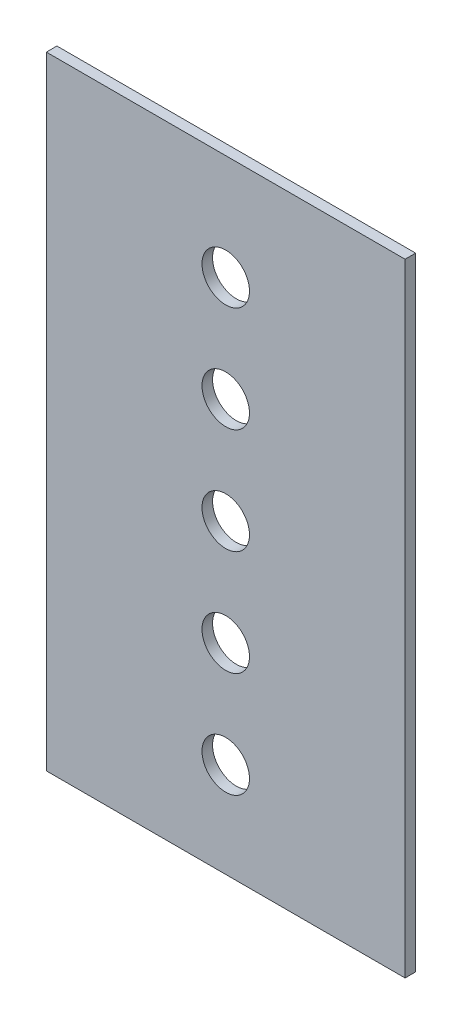
ISO-10303-21;
HEADER;
FILE_DESCRIPTION(('STEP AP214'),'2;1');
FILE_NAME('part.step','',(''),(''),'','','');
FILE_SCHEMA(('AUTOMOTIVE_DESIGN { 1 0 10303 214 1 1 1 1 }'));
ENDSEC;
DATA;
#1=APPLICATION_CONTEXT('core data for automotive mechanical design processes');
#2=APPLICATION_PROTOCOL_DEFINITION('international standard','automotive_design',2000,#1);
#3=PRODUCT_CONTEXT('',#1,'mechanical');
#4=PRODUCT('Part','Part','',(#3));
#5=PRODUCT_RELATED_PRODUCT_CATEGORY('part','',(#4));
#6=PRODUCT_DEFINITION_FORMATION('','',#4);
#7=PRODUCT_DEFINITION_CONTEXT('part definition',#1,'design');
#8=PRODUCT_DEFINITION('design','',#6,#7);
#9=PRODUCT_DEFINITION_SHAPE('','',#8);
#10=(LENGTH_UNIT() NAMED_UNIT(*) SI_UNIT(.MILLI.,.METRE.));
#11=(NAMED_UNIT(*) PLANE_ANGLE_UNIT() SI_UNIT($,.RADIAN.));
#12=(NAMED_UNIT(*) SI_UNIT($,.STERADIAN.) SOLID_ANGLE_UNIT());
#13=UNCERTAINTY_MEASURE_WITH_UNIT(LENGTH_MEASURE(1.E-05),#10,'distance_accuracy_value','');
#14=(GEOMETRIC_REPRESENTATION_CONTEXT(3) GLOBAL_UNCERTAINTY_ASSIGNED_CONTEXT((#13)) GLOBAL_UNIT_ASSIGNED_CONTEXT((#10,
#11,#12)) REPRESENTATION_CONTEXT('',''));
#15=CARTESIAN_POINT('',(0.,0.,0.));
#16=DIRECTION('',(0.,0.,1.));
#17=DIRECTION('',(1.,0.,0.));
#18=AXIS2_PLACEMENT_3D('',#15,#16,#17);
#19=CARTESIAN_POINT('',(0.,0.,1.));
#20=DIRECTION('',(0.,0.,1.));
#21=DIRECTION('',(1.,0.,0.));
#22=AXIS2_PLACEMENT_3D('',#19,#20,#21);
#23=PLANE('',#22);
#24=CARTESIAN_POINT('',(-27.,9.74935860311225,1.));
#25=DIRECTION('',(0.,0.,1.));
#26=DIRECTION('',(1.,0.,0.));
#27=AXIS2_PLACEMENT_3D('',#24,#25,#26);
#28=CIRCLE('',#27,2.25);
#29=CARTESIAN_POINT('',(-24.75,9.74935860311225,1.));
#30=VERTEX_POINT('',#29);
#31=EDGE_CURVE('E130',#30,#30,#28,.T.);
#32=ORIENTED_EDGE('',*,*,#31,.F.);
#33=EDGE_LOOP('',(#32));
#34=FACE_BOUND('',#33,.T.);
#35=CARTESIAN_POINT('',(-27.,29.75,1.));
#36=DIRECTION('',(0.,0.,1.));
#37=DIRECTION('',(1.,0.,0.));
#38=AXIS2_PLACEMENT_3D('',#35,#36,#37);
#39=CIRCLE('',#38,2.25);
#40=CARTESIAN_POINT('',(-24.75,29.75,1.));
#41=VERTEX_POINT('',#40);
#42=EDGE_CURVE('E118',#41,#41,#39,.T.);
#43=ORIENTED_EDGE('',*,*,#42,.F.);
#44=EDGE_LOOP('',(#43));
#45=FACE_BOUND('',#44,.T.);
#46=DIRECTION('',(1.,0.,0.));
#47=VECTOR('',#46,1.);
#48=CARTESIAN_POINT('',(-44.,-9.25,1.));
#49=LINE('',#48,#47);
#50=CARTESIAN_POINT('',(-44.,-9.25,1.));
#51=VERTEX_POINT('',#50);
#52=CARTESIAN_POINT('',(-9.99999999999999,-9.25,1.));
#53=VERTEX_POINT('',#52);
#54=EDGE_CURVE('E88',#51,#53,#49,.T.);
#55=ORIENTED_EDGE('',*,*,#54,.T.);
#56=DIRECTION('',(0.,1.,0.));
#57=VECTOR('',#56,1.);
#58=CARTESIAN_POINT('',(-9.99999999999999,-9.25,1.));
#59=LINE('',#58,#57);
#60=CARTESIAN_POINT('',(-9.99999999999998,49.75,1.));
#61=VERTEX_POINT('',#60);
#62=EDGE_CURVE('E83',#53,#61,#59,.T.);
#63=ORIENTED_EDGE('',*,*,#62,.T.);
#64=DIRECTION('',(-1.,0.,0.));
#65=VECTOR('',#64,1.);
#66=CARTESIAN_POINT('',(-9.99999999999998,49.75,1.));
#67=LINE('',#66,#65);
#68=CARTESIAN_POINT('',(-44.,49.75,1.));
#69=VERTEX_POINT('',#68);
#70=EDGE_CURVE('E86',#61,#69,#67,.T.);
#71=ORIENTED_EDGE('',*,*,#70,.T.);
#72=DIRECTION('',(0.,-1.,0.));
#73=VECTOR('',#72,1.);
#74=CARTESIAN_POINT('',(-44.,49.75,1.));
#75=LINE('',#74,#73);
#76=EDGE_CURVE('E53',#69,#51,#75,.T.);
#77=ORIENTED_EDGE('',*,*,#76,.T.);
#78=EDGE_LOOP('',(#55,#63,#71,#77));
#79=FACE_BOUND('',#78,.T.);
#80=CARTESIAN_POINT('',(-27.,39.75,1.));
#81=DIRECTION('',(0.,0.,1.));
#82=DIRECTION('',(1.,0.,0.));
#83=AXIS2_PLACEMENT_3D('',#80,#81,#82);
#84=CIRCLE('',#83,2.25);
#85=CARTESIAN_POINT('',(-24.75,39.75,1.));
#86=VERTEX_POINT('',#85);
#87=EDGE_CURVE('E103',#86,#86,#84,.T.);
#88=ORIENTED_EDGE('',*,*,#87,.F.);
#89=EDGE_LOOP('',(#88));
#90=FACE_BOUND('',#89,.T.);
#91=CARTESIAN_POINT('',(-27.,19.75,1.));
#92=DIRECTION('',(0.,0.,1.));
#93=DIRECTION('',(1.,0.,0.));
#94=AXIS2_PLACEMENT_3D('',#91,#92,#93);
#95=CIRCLE('',#94,2.25);
#96=CARTESIAN_POINT('',(-24.75,19.75,1.));
#97=VERTEX_POINT('',#96);
#98=EDGE_CURVE('E124',#97,#97,#95,.T.);
#99=ORIENTED_EDGE('',*,*,#98,.F.);
#100=EDGE_LOOP('',(#99));
#101=FACE_BOUND('',#100,.T.);
#102=CARTESIAN_POINT('',(-27.,-0.250641396887753,1.));
#103=DIRECTION('',(0.,0.,1.));
#104=DIRECTION('',(1.,0.,0.));
#105=AXIS2_PLACEMENT_3D('',#102,#103,#104);
#106=CIRCLE('',#105,2.25);
#107=CARTESIAN_POINT('',(-24.75,-0.250641396887753,1.));
#108=VERTEX_POINT('',#107);
#109=EDGE_CURVE('E136',#108,#108,#106,.T.);
#110=ORIENTED_EDGE('',*,*,#109,.F.);
#111=EDGE_LOOP('',(#110));
#112=FACE_BOUND('',#111,.T.);
#113=ADVANCED_FACE('F36',(#34,#45,#79,#90,#101,#112),#23,.T.);
#114=CARTESIAN_POINT('',(0.,0.,0.));
#115=DIRECTION('',(0.,0.,1.));
#116=DIRECTION('',(1.,0.,0.));
#117=AXIS2_PLACEMENT_3D('',#114,#115,#116);
#118=PLANE('',#117);
#119=CARTESIAN_POINT('',(-27.,9.74935860311225,0.));
#120=DIRECTION('',(0.,0.,1.));
#121=DIRECTION('',(1.,0.,0.));
#122=AXIS2_PLACEMENT_3D('',#119,#120,#121);
#123=CIRCLE('',#122,2.25);
#124=CARTESIAN_POINT('',(-24.75,9.74935860311225,0.));
#125=VERTEX_POINT('',#124);
#126=EDGE_CURVE('E133',#125,#125,#123,.T.);
#127=ORIENTED_EDGE('',*,*,#126,.T.);
#128=EDGE_LOOP('',(#127));
#129=FACE_BOUND('',#128,.T.);
#130=CARTESIAN_POINT('',(-27.,29.75,0.));
#131=DIRECTION('',(0.,0.,1.));
#132=DIRECTION('',(1.,0.,0.));
#133=AXIS2_PLACEMENT_3D('',#130,#131,#132);
#134=CIRCLE('',#133,2.25);
#135=CARTESIAN_POINT('',(-24.75,29.75,0.));
#136=VERTEX_POINT('',#135);
#137=EDGE_CURVE('E121',#136,#136,#134,.T.);
#138=ORIENTED_EDGE('',*,*,#137,.T.);
#139=EDGE_LOOP('',(#138));
#140=FACE_BOUND('',#139,.T.);
#141=DIRECTION('',(1.,0.,0.));
#142=VECTOR('',#141,1.);
#143=CARTESIAN_POINT('',(-44.,-9.25,0.));
#144=LINE('',#143,#142);
#145=CARTESIAN_POINT('',(-44.,-9.25,0.));
#146=VERTEX_POINT('',#145);
#147=CARTESIAN_POINT('',(-9.99999999999999,-9.25,0.));
#148=VERTEX_POINT('',#147);
#149=EDGE_CURVE('E100',#146,#148,#144,.T.);
#150=ORIENTED_EDGE('',*,*,#149,.F.);
#151=DIRECTION('',(0.,-1.,0.));
#152=VECTOR('',#151,1.);
#153=CARTESIAN_POINT('',(-44.,49.75,0.));
#154=LINE('',#153,#152);
#155=CARTESIAN_POINT('',(-44.,49.75,0.));
#156=VERTEX_POINT('',#155);
#157=EDGE_CURVE('E76',#156,#146,#154,.T.);
#158=ORIENTED_EDGE('',*,*,#157,.F.);
#159=DIRECTION('',(-1.,0.,0.));
#160=VECTOR('',#159,1.);
#161=CARTESIAN_POINT('',(-9.99999999999998,49.75,0.));
#162=LINE('',#161,#160);
#163=CARTESIAN_POINT('',(-9.99999999999998,49.75,0.));
#164=VERTEX_POINT('',#163);
#165=EDGE_CURVE('E70',#164,#156,#162,.T.);
#166=ORIENTED_EDGE('',*,*,#165,.F.);
#167=DIRECTION('',(0.,1.,0.));
#168=VECTOR('',#167,1.);
#169=CARTESIAN_POINT('',(-9.99999999999999,-9.25,0.));
#170=LINE('',#169,#168);
#171=EDGE_CURVE('E92',#148,#164,#170,.T.);
#172=ORIENTED_EDGE('',*,*,#171,.F.);
#173=EDGE_LOOP('',(#150,#158,#166,#172));
#174=FACE_BOUND('',#173,.T.);
#175=CARTESIAN_POINT('',(-27.,39.75,0.));
#176=DIRECTION('',(0.,0.,1.));
#177=DIRECTION('',(1.,0.,0.));
#178=AXIS2_PLACEMENT_3D('',#175,#176,#177);
#179=CIRCLE('',#178,2.25);
#180=CARTESIAN_POINT('',(-24.75,39.75,0.));
#181=VERTEX_POINT('',#180);
#182=EDGE_CURVE('E115',#181,#181,#179,.T.);
#183=ORIENTED_EDGE('',*,*,#182,.T.);
#184=EDGE_LOOP('',(#183));
#185=FACE_BOUND('',#184,.T.);
#186=CARTESIAN_POINT('',(-27.,19.75,0.));
#187=DIRECTION('',(0.,0.,1.));
#188=DIRECTION('',(1.,0.,0.));
#189=AXIS2_PLACEMENT_3D('',#186,#187,#188);
#190=CIRCLE('',#189,2.25);
#191=CARTESIAN_POINT('',(-24.75,19.75,0.));
#192=VERTEX_POINT('',#191);
#193=EDGE_CURVE('E127',#192,#192,#190,.T.);
#194=ORIENTED_EDGE('',*,*,#193,.T.);
#195=EDGE_LOOP('',(#194));
#196=FACE_BOUND('',#195,.T.);
#197=CARTESIAN_POINT('',(-27.,-0.250641396887753,0.));
#198=DIRECTION('',(0.,0.,1.));
#199=DIRECTION('',(1.,0.,0.));
#200=AXIS2_PLACEMENT_3D('',#197,#198,#199);
#201=CIRCLE('',#200,2.25);
#202=CARTESIAN_POINT('',(-24.75,-0.250641396887753,0.));
#203=VERTEX_POINT('',#202);
#204=EDGE_CURVE('E139',#203,#203,#201,.T.);
#205=ORIENTED_EDGE('',*,*,#204,.T.);
#206=EDGE_LOOP('',(#205));
#207=FACE_BOUND('',#206,.T.);
#208=ADVANCED_FACE('F111',(#129,#140,#174,#185,#196,#207),#118,.F.);
#209=CARTESIAN_POINT('',(-44.,-9.25,1.));
#210=DIRECTION('',(0.,1.,0.));
#211=DIRECTION('',(0.,0.,1.));
#212=AXIS2_PLACEMENT_3D('',#209,#210,#211);
#213=PLANE('',#212);
#214=ORIENTED_EDGE('',*,*,#149,.T.);
#215=DIRECTION('',(0.,0.,-1.));
#216=VECTOR('',#215,1.);
#217=CARTESIAN_POINT('',(-9.99999999999999,-9.25,1.));
#218=LINE('',#217,#216);
#219=EDGE_CURVE('E11',#53,#148,#218,.T.);
#220=ORIENTED_EDGE('',*,*,#219,.F.);
#221=ORIENTED_EDGE('',*,*,#54,.F.);
#222=DIRECTION('',(0.,0.,-1.));
#223=VECTOR('',#222,1.);
#224=CARTESIAN_POINT('',(-44.,-9.25,1.));
#225=LINE('',#224,#223);
#226=EDGE_CURVE('E96',#51,#146,#225,.T.);
#227=ORIENTED_EDGE('',*,*,#226,.T.);
#228=EDGE_LOOP('',(#214,#220,#221,#227));
#229=FACE_BOUND('',#228,.T.);
#230=ADVANCED_FACE('F38',(#229),#213,.F.);
#231=CARTESIAN_POINT('',(-9.99999999999999,-9.25,1.));
#232=DIRECTION('',(-1.,0.,0.));
#233=DIRECTION('',(0.,-1.,0.));
#234=AXIS2_PLACEMENT_3D('',#231,#232,#233);
#235=PLANE('',#234);
#236=ORIENTED_EDGE('',*,*,#171,.T.);
#237=DIRECTION('',(0.,0.,-1.));
#238=VECTOR('',#237,1.);
#239=CARTESIAN_POINT('',(-9.99999999999998,49.75,1.));
#240=LINE('',#239,#238);
#241=EDGE_CURVE('E45',#61,#164,#240,.T.);
#242=ORIENTED_EDGE('',*,*,#241,.F.);
#243=ORIENTED_EDGE('',*,*,#62,.F.);
#244=ORIENTED_EDGE('',*,*,#219,.T.);
#245=EDGE_LOOP('',(#236,#242,#243,#244));
#246=FACE_BOUND('',#245,.T.);
#247=ADVANCED_FACE('F91',(#246),#235,.F.);
#248=CARTESIAN_POINT('',(-9.99999999999998,49.75,1.));
#249=DIRECTION('',(0.,-1.,0.));
#250=DIRECTION('',(0.,0.,-1.));
#251=AXIS2_PLACEMENT_3D('',#248,#249,#250);
#252=PLANE('',#251);
#253=ORIENTED_EDGE('',*,*,#165,.T.);
#254=DIRECTION('',(0.,0.,-1.));
#255=VECTOR('',#254,1.);
#256=CARTESIAN_POINT('',(-44.,49.75,1.));
#257=LINE('',#256,#255);
#258=EDGE_CURVE('E93',#69,#156,#257,.T.);
#259=ORIENTED_EDGE('',*,*,#258,.F.);
#260=ORIENTED_EDGE('',*,*,#70,.F.);
#261=ORIENTED_EDGE('',*,*,#241,.T.);
#262=EDGE_LOOP('',(#253,#259,#260,#261));
#263=FACE_BOUND('',#262,.T.);
#264=ADVANCED_FACE('F94',(#263),#252,.F.);
#265=CARTESIAN_POINT('',(-44.,49.75,1.));
#266=DIRECTION('',(1.,0.,0.));
#267=DIRECTION('',(0.,1.,0.));
#268=AXIS2_PLACEMENT_3D('',#265,#266,#267);
#269=PLANE('',#268);
#270=ORIENTED_EDGE('',*,*,#157,.T.);
#271=ORIENTED_EDGE('',*,*,#226,.F.);
#272=ORIENTED_EDGE('',*,*,#76,.F.);
#273=ORIENTED_EDGE('',*,*,#258,.T.);
#274=EDGE_LOOP('',(#270,#271,#272,#273));
#275=FACE_BOUND('',#274,.T.);
#276=ADVANCED_FACE('F108',(#275),#269,.F.);
#277=CARTESIAN_POINT('',(-27.,39.75,1.));
#278=DIRECTION('',(0.,0.,-1.));
#279=DIRECTION('',(-1.,0.,0.));
#280=AXIS2_PLACEMENT_3D('',#277,#278,#279);
#281=CYLINDRICAL_SURFACE('',#280,2.25);
#282=ORIENTED_EDGE('',*,*,#87,.T.);
#283=EDGE_LOOP('',(#282));
#284=FACE_BOUND('',#283,.T.);
#285=ORIENTED_EDGE('',*,*,#182,.F.);
#286=EDGE_LOOP('',(#285));
#287=FACE_BOUND('',#286,.T.);
#288=ADVANCED_FACE('F159',(#284,#287),#281,.F.);
#289=CARTESIAN_POINT('',(-27.,29.75,1.));
#290=DIRECTION('',(0.,0.,-1.));
#291=DIRECTION('',(-1.,0.,0.));
#292=AXIS2_PLACEMENT_3D('',#289,#290,#291);
#293=CYLINDRICAL_SURFACE('',#292,2.25);
#294=ORIENTED_EDGE('',*,*,#42,.T.);
#295=EDGE_LOOP('',(#294));
#296=FACE_BOUND('',#295,.T.);
#297=ORIENTED_EDGE('',*,*,#137,.F.);
#298=EDGE_LOOP('',(#297));
#299=FACE_BOUND('',#298,.T.);
#300=ADVANCED_FACE('F205',(#296,#299),#293,.F.);
#301=CARTESIAN_POINT('',(-27.,19.75,1.));
#302=DIRECTION('',(0.,0.,-1.));
#303=DIRECTION('',(-1.,0.,0.));
#304=AXIS2_PLACEMENT_3D('',#301,#302,#303);
#305=CYLINDRICAL_SURFACE('',#304,2.25);
#306=ORIENTED_EDGE('',*,*,#98,.T.);
#307=EDGE_LOOP('',(#306));
#308=FACE_BOUND('',#307,.T.);
#309=ORIENTED_EDGE('',*,*,#193,.F.);
#310=EDGE_LOOP('',(#309));
#311=FACE_BOUND('',#310,.T.);
#312=ADVANCED_FACE('F213',(#308,#311),#305,.F.);
#313=CARTESIAN_POINT('',(-27.,9.74935860311225,1.));
#314=DIRECTION('',(0.,0.,-1.));
#315=DIRECTION('',(-1.,0.,0.));
#316=AXIS2_PLACEMENT_3D('',#313,#314,#315);
#317=CYLINDRICAL_SURFACE('',#316,2.25);
#318=ORIENTED_EDGE('',*,*,#31,.T.);
#319=EDGE_LOOP('',(#318));
#320=FACE_BOUND('',#319,.T.);
#321=ORIENTED_EDGE('',*,*,#126,.F.);
#322=EDGE_LOOP('',(#321));
#323=FACE_BOUND('',#322,.T.);
#324=ADVANCED_FACE('F221',(#320,#323),#317,.F.);
#325=CARTESIAN_POINT('',(-27.,-0.250641396887753,1.));
#326=DIRECTION('',(0.,0.,-1.));
#327=DIRECTION('',(-1.,0.,0.));
#328=AXIS2_PLACEMENT_3D('',#325,#326,#327);
#329=CYLINDRICAL_SURFACE('',#328,2.25);
#330=ORIENTED_EDGE('',*,*,#109,.T.);
#331=EDGE_LOOP('',(#330));
#332=FACE_BOUND('',#331,.T.);
#333=ORIENTED_EDGE('',*,*,#204,.F.);
#334=EDGE_LOOP('',(#333));
#335=FACE_BOUND('',#334,.T.);
#336=ADVANCED_FACE('F145',(#332,#335),#329,.F.);
#337=CLOSED_SHELL('',(#113,#208,#230,#247,#264,#276,#288,#300,#312,#324,#336));
#338=MANIFOLD_SOLID_BREP('B2',#337);
#339=ADVANCED_BREP_SHAPE_REPRESENTATION('',(#18,#338),#14);
#340=SHAPE_DEFINITION_REPRESENTATION(#9,#339);
ENDSEC;
END-ISO-10303-21;
